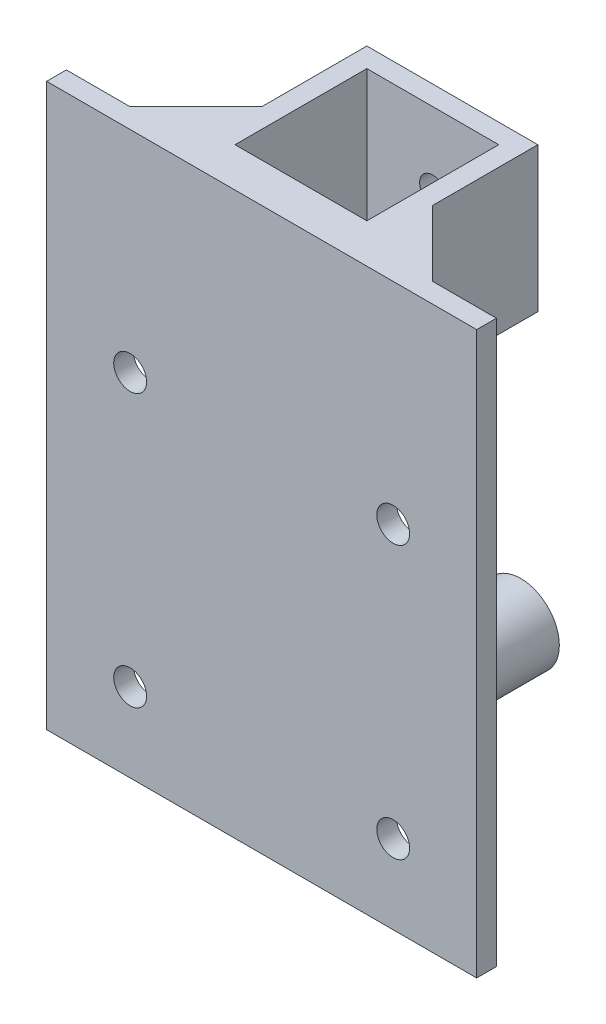
ISO-10303-21;
HEADER;
FILE_DESCRIPTION(('STEP AP214'),'2;1');
FILE_NAME('part.step','',(''),(''),'','','');
FILE_SCHEMA(('AUTOMOTIVE_DESIGN { 1 0 10303 214 1 1 1 1 }'));
ENDSEC;
DATA;
#1=APPLICATION_CONTEXT('core data for automotive mechanical design processes');
#2=APPLICATION_PROTOCOL_DEFINITION('international standard','automotive_design',2000,#1);
#3=PRODUCT_CONTEXT('',#1,'mechanical');
#4=PRODUCT('Part','Part','',(#3));
#5=PRODUCT_RELATED_PRODUCT_CATEGORY('part','',(#4));
#6=PRODUCT_DEFINITION_FORMATION('','',#4);
#7=PRODUCT_DEFINITION_CONTEXT('part definition',#1,'design');
#8=PRODUCT_DEFINITION('design','',#6,#7);
#9=PRODUCT_DEFINITION_SHAPE('','',#8);
#10=(LENGTH_UNIT() NAMED_UNIT(*) SI_UNIT(.MILLI.,.METRE.));
#11=(NAMED_UNIT(*) PLANE_ANGLE_UNIT() SI_UNIT($,.RADIAN.));
#12=(NAMED_UNIT(*) SI_UNIT($,.STERADIAN.) SOLID_ANGLE_UNIT());
#13=UNCERTAINTY_MEASURE_WITH_UNIT(LENGTH_MEASURE(1.E-05),#10,'distance_accuracy_value','');
#14=(GEOMETRIC_REPRESENTATION_CONTEXT(3) GLOBAL_UNCERTAINTY_ASSIGNED_CONTEXT((#13)) GLOBAL_UNIT_ASSIGNED_CONTEXT((#10,
#11,#12)) REPRESENTATION_CONTEXT('',''));
#15=CARTESIAN_POINT('',(0.,0.,0.));
#16=DIRECTION('',(0.,0.,1.));
#17=DIRECTION('',(1.,0.,0.));
#18=AXIS2_PLACEMENT_3D('',#15,#16,#17);
#19=CARTESIAN_POINT('',(0.,0.,0.));
#20=DIRECTION('',(0.,0.,1.));
#21=DIRECTION('',(1.,0.,0.));
#22=AXIS2_PLACEMENT_3D('',#19,#20,#21);
#23=PLANE('',#22);
#24=CARTESIAN_POINT('',(-54.7,32.7,0.));
#25=DIRECTION('',(0.,0.,1.));
#26=DIRECTION('',(1.,0.,0.));
#27=AXIS2_PLACEMENT_3D('',#24,#25,#26);
#28=CIRCLE('',#27,5.);
#29=CARTESIAN_POINT('',(-49.7,32.7,0.));
#30=VERTEX_POINT('',#29);
#31=EDGE_CURVE('E317',#30,#30,#28,.F.);
#32=ORIENTED_EDGE('',*,*,#31,.F.);
#33=EDGE_LOOP('',(#32));
#34=FACE_BOUND('',#33,.T.);
#35=CARTESIAN_POINT('',(-10.7,32.7,0.));
#36=DIRECTION('',(0.,0.,1.));
#37=DIRECTION('',(1.,0.,0.));
#38=AXIS2_PLACEMENT_3D('',#35,#36,#37);
#39=CIRCLE('',#38,5.87255145259778);
#40=CARTESIAN_POINT('',(-4.82744854740222,32.7,0.));
#41=VERTEX_POINT('',#40);
#42=EDGE_CURVE('E313',#41,#41,#39,.F.);
#43=ORIENTED_EDGE('',*,*,#42,.F.);
#44=EDGE_LOOP('',(#43));
#45=FACE_BOUND('',#44,.T.);
#46=CARTESIAN_POINT('',(-52.7,12.,0.));
#47=DIRECTION('',(0.,0.,1.));
#48=DIRECTION('',(-1.,0.,0.));
#49=AXIS2_PLACEMENT_3D('',#46,#47,#48);
#50=CIRCLE('',#49,2.5);
#51=CARTESIAN_POINT('',(-55.2,12.,0.));
#52=VERTEX_POINT('',#51);
#53=EDGE_CURVE('E238',#52,#52,#50,.T.);
#54=ORIENTED_EDGE('',*,*,#53,.T.);
#55=EDGE_LOOP('',(#54));
#56=FACE_BOUND('',#55,.T.);
#57=CARTESIAN_POINT('',(-12.7,12.,0.));
#58=DIRECTION('',(0.,0.,1.));
#59=DIRECTION('',(1.,0.,0.));
#60=AXIS2_PLACEMENT_3D('',#57,#58,#59);
#61=CIRCLE('',#60,2.5);
#62=CARTESIAN_POINT('',(-10.2,12.,0.));
#63=VERTEX_POINT('',#62);
#64=EDGE_CURVE('E243',#63,#63,#61,.T.);
#65=ORIENTED_EDGE('',*,*,#64,.T.);
#66=EDGE_LOOP('',(#65));
#67=FACE_BOUND('',#66,.T.);
#68=CARTESIAN_POINT('',(-12.7,53.4,0.));
#69=DIRECTION('',(0.,0.,1.));
#70=DIRECTION('',(-1.,0.,0.));
#71=AXIS2_PLACEMENT_3D('',#68,#69,#70);
#72=CIRCLE('',#71,2.5);
#73=CARTESIAN_POINT('',(-15.2,53.4,0.));
#74=VERTEX_POINT('',#73);
#75=EDGE_CURVE('E251',#74,#74,#72,.T.);
#76=ORIENTED_EDGE('',*,*,#75,.T.);
#77=EDGE_LOOP('',(#76));
#78=FACE_BOUND('',#77,.T.);
#79=CARTESIAN_POINT('',(-52.7,53.4,0.));
#80=DIRECTION('',(0.,0.,1.));
#81=DIRECTION('',(1.,0.,0.));
#82=AXIS2_PLACEMENT_3D('',#79,#80,#81);
#83=CIRCLE('',#82,2.5);
#84=CARTESIAN_POINT('',(-50.2,53.4,0.));
#85=VERTEX_POINT('',#84);
#86=EDGE_CURVE('E259',#85,#85,#83,.T.);
#87=ORIENTED_EDGE('',*,*,#86,.T.);
#88=EDGE_LOOP('',(#87));
#89=FACE_BOUND('',#88,.T.);
#90=DIRECTION('',(-1.,0.,0.));
#91=VECTOR('',#90,1.);
#92=CARTESIAN_POINT('',(-19.7,63.4,0.));
#93=LINE('',#92,#91);
#94=CARTESIAN_POINT('',(-9.70000000000007,63.4,0.));
#95=VERTEX_POINT('',#94);
#96=CARTESIAN_POINT('',(-55.6999999999999,63.4,0.));
#97=VERTEX_POINT('',#96);
#98=EDGE_CURVE('E65',#95,#97,#93,.T.);
#99=ORIENTED_EDGE('',*,*,#98,.F.);
#100=DIRECTION('',(0.,1.,0.));
#101=VECTOR('',#100,1.);
#102=CARTESIAN_POINT('',(-9.70000000000007,85.4,0.));
#103=LINE('',#102,#101);
#104=CARTESIAN_POINT('',(-9.70000000000007,85.4,0.));
#105=VERTEX_POINT('',#104);
#106=EDGE_CURVE('E70',#95,#105,#103,.T.);
#107=ORIENTED_EDGE('',*,*,#106,.T.);
#108=DIRECTION('',(-1.,0.,0.));
#109=VECTOR('',#108,1.);
#110=CARTESIAN_POINT('',(0.,85.4,0.));
#111=LINE('',#110,#109);
#112=CARTESIAN_POINT('',(0.,85.4,0.));
#113=VERTEX_POINT('',#112);
#114=EDGE_CURVE('E290',#113,#105,#111,.T.);
#115=ORIENTED_EDGE('',*,*,#114,.F.);
#116=DIRECTION('',(0.,1.,0.));
#117=VECTOR('',#116,1.);
#118=CARTESIAN_POINT('',(0.,0.,0.));
#119=LINE('',#118,#117);
#120=CARTESIAN_POINT('',(0.,0.,0.));
#121=VERTEX_POINT('',#120);
#122=EDGE_CURVE('E267',#121,#113,#119,.T.);
#123=ORIENTED_EDGE('',*,*,#122,.F.);
#124=DIRECTION('',(1.,0.,0.));
#125=VECTOR('',#124,1.);
#126=CARTESIAN_POINT('',(0.,0.,0.));
#127=LINE('',#126,#125);
#128=CARTESIAN_POINT('',(-65.4,0.,0.));
#129=VERTEX_POINT('',#128);
#130=EDGE_CURVE('E276',#129,#121,#127,.T.);
#131=ORIENTED_EDGE('',*,*,#130,.F.);
#132=DIRECTION('',(0.,-1.,0.));
#133=VECTOR('',#132,1.);
#134=CARTESIAN_POINT('',(-65.4,0.,0.));
#135=LINE('',#134,#133);
#136=CARTESIAN_POINT('',(-65.4,85.4,0.));
#137=VERTEX_POINT('',#136);
#138=EDGE_CURVE('E293',#137,#129,#135,.T.);
#139=ORIENTED_EDGE('',*,*,#138,.F.);
#140=CARTESIAN_POINT('',(-55.6999999999999,85.4,0.));
#141=VERTEX_POINT('',#140);
#142=EDGE_CURVE('E289',#141,#137,#111,.T.);
#143=ORIENTED_EDGE('',*,*,#142,.F.);
#144=DIRECTION('',(0.,-1.,0.));
#145=VECTOR('',#144,1.);
#146=CARTESIAN_POINT('',(-55.6999999999999,63.4,0.));
#147=LINE('',#146,#145);
#148=EDGE_CURVE('E325',#141,#97,#147,.T.);
#149=ORIENTED_EDGE('',*,*,#148,.T.);
#150=EDGE_LOOP('',(#99,#107,#115,#123,#131,#139,#143,#149));
#151=FACE_BOUND('',#150,.T.);
#152=ADVANCED_FACE('F47',(#34,#45,#56,#67,#78,#89,#151),#23,.F.);
#153=CARTESIAN_POINT('',(0.,0.,3.));
#154=DIRECTION('',(0.,0.,1.));
#155=DIRECTION('',(1.,0.,0.));
#156=AXIS2_PLACEMENT_3D('',#153,#154,#155);
#157=PLANE('',#156);
#158=CARTESIAN_POINT('',(-12.7,12.,3.));
#159=DIRECTION('',(0.,0.,1.));
#160=DIRECTION('',(1.,0.,0.));
#161=AXIS2_PLACEMENT_3D('',#158,#159,#160);
#162=CIRCLE('',#161,2.5);
#163=CARTESIAN_POINT('',(-10.2,12.,3.));
#164=VERTEX_POINT('',#163);
#165=EDGE_CURVE('E247',#164,#164,#162,.T.);
#166=ORIENTED_EDGE('',*,*,#165,.F.);
#167=EDGE_LOOP('',(#166));
#168=FACE_BOUND('',#167,.T.);
#169=CARTESIAN_POINT('',(-52.7,53.4,3.));
#170=DIRECTION('',(0.,0.,1.));
#171=DIRECTION('',(1.,0.,0.));
#172=AXIS2_PLACEMENT_3D('',#169,#170,#171);
#173=CIRCLE('',#172,2.5);
#174=CARTESIAN_POINT('',(-50.2,53.4,3.));
#175=VERTEX_POINT('',#174);
#176=EDGE_CURVE('E263',#175,#175,#173,.T.);
#177=ORIENTED_EDGE('',*,*,#176,.F.);
#178=EDGE_LOOP('',(#177));
#179=FACE_BOUND('',#178,.T.);
#180=DIRECTION('',(0.,1.,0.));
#181=VECTOR('',#180,1.);
#182=CARTESIAN_POINT('',(0.,0.,3.));
#183=LINE('',#182,#181);
#184=CARTESIAN_POINT('',(0.,0.,3.));
#185=VERTEX_POINT('',#184);
#186=CARTESIAN_POINT('',(0.,85.4,3.));
#187=VERTEX_POINT('',#186);
#188=EDGE_CURVE('E271',#185,#187,#183,.T.);
#189=ORIENTED_EDGE('',*,*,#188,.T.);
#190=DIRECTION('',(-1.,0.,0.));
#191=VECTOR('',#190,1.);
#192=CARTESIAN_POINT('',(0.,85.4,3.));
#193=LINE('',#192,#191);
#194=CARTESIAN_POINT('',(-65.4,85.4,3.));
#195=VERTEX_POINT('',#194);
#196=EDGE_CURVE('E275',#187,#195,#193,.T.);
#197=ORIENTED_EDGE('',*,*,#196,.T.);
#198=DIRECTION('',(0.,-1.,0.));
#199=VECTOR('',#198,1.);
#200=CARTESIAN_POINT('',(-65.4,0.,3.));
#201=LINE('',#200,#199);
#202=CARTESIAN_POINT('',(-65.4,0.,3.));
#203=VERTEX_POINT('',#202);
#204=EDGE_CURVE('E279',#195,#203,#201,.T.);
#205=ORIENTED_EDGE('',*,*,#204,.T.);
#206=DIRECTION('',(1.,0.,0.));
#207=VECTOR('',#206,1.);
#208=CARTESIAN_POINT('',(0.,0.,3.));
#209=LINE('',#208,#207);
#210=EDGE_CURVE('E282',#203,#185,#209,.T.);
#211=ORIENTED_EDGE('',*,*,#210,.T.);
#212=EDGE_LOOP('',(#189,#197,#205,#211));
#213=FACE_BOUND('',#212,.T.);
#214=CARTESIAN_POINT('',(-12.7,53.4,3.));
#215=DIRECTION('',(0.,0.,1.));
#216=DIRECTION('',(-1.,0.,0.));
#217=AXIS2_PLACEMENT_3D('',#214,#215,#216);
#218=CIRCLE('',#217,2.5);
#219=CARTESIAN_POINT('',(-15.2,53.4,3.));
#220=VERTEX_POINT('',#219);
#221=EDGE_CURVE('E255',#220,#220,#218,.T.);
#222=ORIENTED_EDGE('',*,*,#221,.F.);
#223=EDGE_LOOP('',(#222));
#224=FACE_BOUND('',#223,.T.);
#225=CARTESIAN_POINT('',(-52.7,12.,3.));
#226=DIRECTION('',(0.,0.,1.));
#227=DIRECTION('',(-1.,0.,0.));
#228=AXIS2_PLACEMENT_3D('',#225,#226,#227);
#229=CIRCLE('',#228,2.5);
#230=CARTESIAN_POINT('',(-55.2,12.,3.));
#231=VERTEX_POINT('',#230);
#232=EDGE_CURVE('E239',#231,#231,#229,.T.);
#233=ORIENTED_EDGE('',*,*,#232,.F.);
#234=EDGE_LOOP('',(#233));
#235=FACE_BOUND('',#234,.T.);
#236=ADVANCED_FACE('F375',(#168,#179,#213,#224,#235),#157,.T.);
#237=CARTESIAN_POINT('',(0.,0.,3.));
#238=DIRECTION('',(-1.,0.,0.));
#239=DIRECTION('',(0.,-1.,0.));
#240=AXIS2_PLACEMENT_3D('',#237,#238,#239);
#241=PLANE('',#240);
#242=ORIENTED_EDGE('',*,*,#122,.T.);
#243=DIRECTION('',(0.,0.,-1.));
#244=VECTOR('',#243,1.);
#245=CARTESIAN_POINT('',(0.,85.4,3.));
#246=LINE('',#245,#244);
#247=EDGE_CURVE('E309',#187,#113,#246,.T.);
#248=ORIENTED_EDGE('',*,*,#247,.F.);
#249=ORIENTED_EDGE('',*,*,#188,.F.);
#250=DIRECTION('',(0.,0.,-1.));
#251=VECTOR('',#250,1.);
#252=CARTESIAN_POINT('',(0.,0.,3.));
#253=LINE('',#252,#251);
#254=EDGE_CURVE('E285',#185,#121,#253,.T.);
#255=ORIENTED_EDGE('',*,*,#254,.T.);
#256=EDGE_LOOP('',(#242,#248,#249,#255));
#257=FACE_BOUND('',#256,.T.);
#258=ADVANCED_FACE('F382',(#257),#241,.F.);
#259=CARTESIAN_POINT('',(0.,85.4,3.));
#260=DIRECTION('',(0.,-1.,0.));
#261=DIRECTION('',(0.,0.,-1.));
#262=AXIS2_PLACEMENT_3D('',#259,#260,#261);
#263=PLANE('',#262);
#264=DIRECTION('',(-1.,0.,0.));
#265=VECTOR('',#264,1.);
#266=CARTESIAN_POINT('',(-42.725,85.4,-2.975));
#267=LINE('',#266,#265);
#268=CARTESIAN_POINT('',(-22.675,85.4,-2.975));
#269=VERTEX_POINT('',#268);
#270=CARTESIAN_POINT('',(-42.725,85.4,-2.975));
#271=VERTEX_POINT('',#270);
#272=EDGE_CURVE('E162',#269,#271,#267,.T.);
#273=ORIENTED_EDGE('',*,*,#272,.T.);
#274=DIRECTION('',(0.,0.,-1.));
#275=VECTOR('',#274,1.);
#276=CARTESIAN_POINT('',(-42.725,85.4,-2.975));
#277=LINE('',#276,#275);
#278=CARTESIAN_POINT('',(-42.725,85.4,-23.025));
#279=VERTEX_POINT('',#278);
#280=EDGE_CURVE('E153',#271,#279,#277,.T.);
#281=ORIENTED_EDGE('',*,*,#280,.T.);
#282=DIRECTION('',(1.,0.,0.));
#283=VECTOR('',#282,1.);
#284=CARTESIAN_POINT('',(-42.725,85.4,-23.025));
#285=LINE('',#284,#283);
#286=CARTESIAN_POINT('',(-22.675,85.4,-23.025));
#287=VERTEX_POINT('',#286);
#288=EDGE_CURVE('E166',#279,#287,#285,.T.);
#289=ORIENTED_EDGE('',*,*,#288,.T.);
#290=DIRECTION('',(0.,0.,1.));
#291=VECTOR('',#290,1.);
#292=CARTESIAN_POINT('',(-22.675,85.4,-2.975));
#293=LINE('',#292,#291);
#294=EDGE_CURVE('E171',#287,#269,#293,.T.);
#295=ORIENTED_EDGE('',*,*,#294,.T.);
#296=EDGE_LOOP('',(#273,#281,#289,#295));
#297=FACE_BOUND('',#296,.T.);
#298=ORIENTED_EDGE('',*,*,#114,.T.);
#299=DIRECTION('',(0.707106781186543,0.,0.707106781186552));
#300=VECTOR('',#299,1.);
#301=CARTESIAN_POINT('',(-3.35000000000009,85.4,6.35000000000005));
#302=LINE('',#301,#300);
#303=CARTESIAN_POINT('',(-19.7,85.4,-10.0000000000001));
#304=VERTEX_POINT('',#303);
#305=EDGE_CURVE('E11',#105,#304,#302,.F.);
#306=ORIENTED_EDGE('',*,*,#305,.T.);
#307=DIRECTION('',(0.,0.,1.));
#308=VECTOR('',#307,1.);
#309=CARTESIAN_POINT('',(-19.7,85.4,-26.));
#310=LINE('',#309,#308);
#311=CARTESIAN_POINT('',(-19.7,85.4,-26.));
#312=VERTEX_POINT('',#311);
#313=EDGE_CURVE('E220',#312,#304,#310,.T.);
#314=ORIENTED_EDGE('',*,*,#313,.F.);
#315=DIRECTION('',(1.,0.,0.));
#316=VECTOR('',#315,1.);
#317=CARTESIAN_POINT('',(-19.7,85.4,-26.));
#318=LINE('',#317,#316);
#319=CARTESIAN_POINT('',(-45.7,85.4,-26.));
#320=VERTEX_POINT('',#319);
#321=EDGE_CURVE('E217',#320,#312,#318,.T.);
#322=ORIENTED_EDGE('',*,*,#321,.F.);
#323=DIRECTION('',(0.,0.,1.));
#324=VECTOR('',#323,1.);
#325=CARTESIAN_POINT('',(-45.7,85.4,-26.));
#326=LINE('',#325,#324);
#327=CARTESIAN_POINT('',(-45.7,85.4,-10.0000000000001));
#328=VERTEX_POINT('',#327);
#329=EDGE_CURVE('E226',#320,#328,#326,.T.);
#330=ORIENTED_EDGE('',*,*,#329,.T.);
#331=DIRECTION('',(0.707106781186544,0.,-0.707106781186551));
#332=VECTOR('',#331,1.);
#333=CARTESIAN_POINT('',(-29.3500000000003,85.4,-26.3499999999999));
#334=LINE('',#333,#332);
#335=EDGE_CURVE('E328',#328,#141,#334,.F.);
#336=ORIENTED_EDGE('',*,*,#335,.T.);
#337=ORIENTED_EDGE('',*,*,#142,.T.);
#338=DIRECTION('',(0.,0.,-1.));
#339=VECTOR('',#338,1.);
#340=CARTESIAN_POINT('',(-65.4,85.4,3.));
#341=LINE('',#340,#339);
#342=EDGE_CURVE('E305',#195,#137,#341,.T.);
#343=ORIENTED_EDGE('',*,*,#342,.F.);
#344=ORIENTED_EDGE('',*,*,#196,.F.);
#345=ORIENTED_EDGE('',*,*,#247,.T.);
#346=EDGE_LOOP('',(#298,#306,#314,#322,#330,#336,#337,#343,#344,#345));
#347=FACE_BOUND('',#346,.T.);
#348=ADVANCED_FACE('F173',(#297,#347),#263,.F.);
#349=CARTESIAN_POINT('',(-65.4,0.,3.));
#350=DIRECTION('',(1.,0.,0.));
#351=DIRECTION('',(0.,0.,-1.));
#352=AXIS2_PLACEMENT_3D('',#349,#350,#351);
#353=PLANE('',#352);
#354=ORIENTED_EDGE('',*,*,#138,.T.);
#355=DIRECTION('',(0.,0.,-1.));
#356=VECTOR('',#355,1.);
#357=CARTESIAN_POINT('',(-65.4,0.,3.));
#358=LINE('',#357,#356);
#359=EDGE_CURVE('E301',#203,#129,#358,.T.);
#360=ORIENTED_EDGE('',*,*,#359,.F.);
#361=ORIENTED_EDGE('',*,*,#204,.F.);
#362=ORIENTED_EDGE('',*,*,#342,.T.);
#363=EDGE_LOOP('',(#354,#360,#361,#362));
#364=FACE_BOUND('',#363,.T.);
#365=ADVANCED_FACE('F371',(#364),#353,.F.);
#366=CARTESIAN_POINT('',(0.,0.,3.));
#367=DIRECTION('',(0.,1.,0.));
#368=DIRECTION('',(-1.,0.,0.));
#369=AXIS2_PLACEMENT_3D('',#366,#367,#368);
#370=PLANE('',#369);
#371=ORIENTED_EDGE('',*,*,#130,.T.);
#372=ORIENTED_EDGE('',*,*,#254,.F.);
#373=ORIENTED_EDGE('',*,*,#210,.F.);
#374=ORIENTED_EDGE('',*,*,#359,.T.);
#375=EDGE_LOOP('',(#371,#372,#373,#374));
#376=FACE_BOUND('',#375,.T.);
#377=ADVANCED_FACE('F384',(#376),#370,.F.);
#378=CARTESIAN_POINT('',(-52.7,53.4,3.));
#379=DIRECTION('',(0.,0.,-1.));
#380=DIRECTION('',(-1.,0.,0.));
#381=AXIS2_PLACEMENT_3D('',#378,#379,#380);
#382=CYLINDRICAL_SURFACE('',#381,2.5);
#383=ORIENTED_EDGE('',*,*,#176,.T.);
#384=EDGE_LOOP('',(#383));
#385=FACE_BOUND('',#384,.T.);
#386=ORIENTED_EDGE('',*,*,#86,.F.);
#387=EDGE_LOOP('',(#386));
#388=FACE_BOUND('',#387,.T.);
#389=ADVANCED_FACE('F386',(#385,#388),#382,.F.);
#390=CARTESIAN_POINT('',(-12.7,53.4,3.));
#391=DIRECTION('',(0.,0.,-1.));
#392=DIRECTION('',(-1.,0.,0.));
#393=AXIS2_PLACEMENT_3D('',#390,#391,#392);
#394=CYLINDRICAL_SURFACE('',#393,2.5);
#395=ORIENTED_EDGE('',*,*,#221,.T.);
#396=EDGE_LOOP('',(#395));
#397=FACE_BOUND('',#396,.T.);
#398=ORIENTED_EDGE('',*,*,#75,.F.);
#399=EDGE_LOOP('',(#398));
#400=FACE_BOUND('',#399,.T.);
#401=ADVANCED_FACE('F392',(#397,#400),#394,.F.);
#402=CARTESIAN_POINT('',(-12.7,12.,3.));
#403=DIRECTION('',(0.,0.,-1.));
#404=DIRECTION('',(-1.,0.,0.));
#405=AXIS2_PLACEMENT_3D('',#402,#403,#404);
#406=CYLINDRICAL_SURFACE('',#405,2.5);
#407=ORIENTED_EDGE('',*,*,#165,.T.);
#408=EDGE_LOOP('',(#407));
#409=FACE_BOUND('',#408,.T.);
#410=ORIENTED_EDGE('',*,*,#64,.F.);
#411=EDGE_LOOP('',(#410));
#412=FACE_BOUND('',#411,.T.);
#413=ADVANCED_FACE('F411',(#409,#412),#406,.F.);
#414=CARTESIAN_POINT('',(-52.7,12.,3.));
#415=DIRECTION('',(0.,0.,-1.));
#416=DIRECTION('',(-1.,0.,0.));
#417=AXIS2_PLACEMENT_3D('',#414,#415,#416);
#418=CYLINDRICAL_SURFACE('',#417,2.5);
#419=ORIENTED_EDGE('',*,*,#232,.T.);
#420=EDGE_LOOP('',(#419));
#421=FACE_BOUND('',#420,.T.);
#422=ORIENTED_EDGE('',*,*,#53,.F.);
#423=EDGE_LOOP('',(#422));
#424=FACE_BOUND('',#423,.T.);
#425=ADVANCED_FACE('F415',(#421,#424),#418,.F.);
#426=CARTESIAN_POINT('',(-19.7,85.4,-26.));
#427=DIRECTION('',(-1.,0.,0.));
#428=DIRECTION('',(0.,-1.,0.));
#429=AXIS2_PLACEMENT_3D('',#426,#427,#428);
#430=PLANE('',#429);
#431=ORIENTED_EDGE('',*,*,#313,.T.);
#432=DIRECTION('',(0.,-1.,0.));
#433=VECTOR('',#432,1.);
#434=CARTESIAN_POINT('',(-19.7,63.4,-10.));
#435=LINE('',#434,#433);
#436=CARTESIAN_POINT('',(-19.7,63.4,-10.0000000000001));
#437=VERTEX_POINT('',#436);
#438=EDGE_CURVE('E334',#304,#437,#435,.T.);
#439=ORIENTED_EDGE('',*,*,#438,.T.);
#440=DIRECTION('',(0.,0.,1.));
#441=VECTOR('',#440,1.);
#442=CARTESIAN_POINT('',(-19.7,63.4,-26.));
#443=LINE('',#442,#441);
#444=CARTESIAN_POINT('',(-19.7,63.4,-26.));
#445=VERTEX_POINT('',#444);
#446=EDGE_CURVE('E234',#445,#437,#443,.T.);
#447=ORIENTED_EDGE('',*,*,#446,.F.);
#448=DIRECTION('',(0.,-1.,0.));
#449=VECTOR('',#448,1.);
#450=CARTESIAN_POINT('',(-19.7,85.4,-26.));
#451=LINE('',#450,#449);
#452=EDGE_CURVE('E207',#312,#445,#451,.T.);
#453=ORIENTED_EDGE('',*,*,#452,.F.);
#454=EDGE_LOOP('',(#431,#439,#447,#453));
#455=FACE_BOUND('',#454,.T.);
#456=ADVANCED_FACE('F351',(#455),#430,.F.);
#457=CARTESIAN_POINT('',(-19.7,63.4,-26.));
#458=DIRECTION('',(0.,1.,0.));
#459=DIRECTION('',(0.,0.,1.));
#460=AXIS2_PLACEMENT_3D('',#457,#458,#459);
#461=PLANE('',#460);
#462=DIRECTION('',(1.,0.,0.));
#463=VECTOR('',#462,1.);
#464=CARTESIAN_POINT('',(-42.725,63.4,-23.025));
#465=LINE('',#464,#463);
#466=CARTESIAN_POINT('',(-42.725,63.4,-23.025));
#467=VERTEX_POINT('',#466);
#468=CARTESIAN_POINT('',(-22.675,63.4,-23.025));
#469=VERTEX_POINT('',#468);
#470=EDGE_CURVE('E193',#467,#469,#465,.T.);
#471=ORIENTED_EDGE('',*,*,#470,.F.);
#472=DIRECTION('',(0.,0.,-1.));
#473=VECTOR('',#472,1.);
#474=CARTESIAN_POINT('',(-42.725,63.4,-2.975));
#475=LINE('',#474,#473);
#476=CARTESIAN_POINT('',(-42.725,63.4,-2.975));
#477=VERTEX_POINT('',#476);
#478=EDGE_CURVE('E156',#477,#467,#475,.T.);
#479=ORIENTED_EDGE('',*,*,#478,.F.);
#480=DIRECTION('',(-1.,0.,0.));
#481=VECTOR('',#480,1.);
#482=CARTESIAN_POINT('',(-42.725,63.4,-2.975));
#483=LINE('',#482,#481);
#484=CARTESIAN_POINT('',(-22.675,63.4,-2.975));
#485=VERTEX_POINT('',#484);
#486=EDGE_CURVE('E177',#485,#477,#483,.T.);
#487=ORIENTED_EDGE('',*,*,#486,.F.);
#488=DIRECTION('',(0.,0.,1.));
#489=VECTOR('',#488,1.);
#490=CARTESIAN_POINT('',(-22.675,63.4,-2.975));
#491=LINE('',#490,#489);
#492=EDGE_CURVE('E181',#469,#485,#491,.T.);
#493=ORIENTED_EDGE('',*,*,#492,.F.);
#494=EDGE_LOOP('',(#471,#479,#487,#493));
#495=FACE_BOUND('',#494,.T.);
#496=ORIENTED_EDGE('',*,*,#98,.T.);
#497=DIRECTION('',(-0.707106781186544,0.,0.707106781186551));
#498=VECTOR('',#497,1.);
#499=CARTESIAN_POINT('',(-24.7000000000002,63.4,-31.0000000000001));
#500=LINE('',#499,#498);
#501=CARTESIAN_POINT('',(-45.7,63.4,-10.0000000000001));
#502=VERTEX_POINT('',#501);
#503=EDGE_CURVE('E331',#97,#502,#500,.F.);
#504=ORIENTED_EDGE('',*,*,#503,.T.);
#505=DIRECTION('',(0.,0.,1.));
#506=VECTOR('',#505,1.);
#507=CARTESIAN_POINT('',(-45.7,63.4,-26.));
#508=LINE('',#507,#506);
#509=CARTESIAN_POINT('',(-45.7,63.4,-26.));
#510=VERTEX_POINT('',#509);
#511=EDGE_CURVE('E230',#510,#502,#508,.T.);
#512=ORIENTED_EDGE('',*,*,#511,.F.);
#513=DIRECTION('',(-1.,0.,0.));
#514=VECTOR('',#513,1.);
#515=CARTESIAN_POINT('',(-19.7,63.4,-26.));
#516=LINE('',#515,#514);
#517=EDGE_CURVE('E211',#445,#510,#516,.T.);
#518=ORIENTED_EDGE('',*,*,#517,.F.);
#519=ORIENTED_EDGE('',*,*,#446,.T.);
#520=DIRECTION('',(-0.707106781186543,0.,-0.707106781186552));
#521=VECTOR('',#520,1.);
#522=CARTESIAN_POINT('',(-27.7,63.4,-18.0000000000001));
#523=LINE('',#522,#521);
#524=EDGE_CURVE('E58',#437,#95,#523,.F.);
#525=ORIENTED_EDGE('',*,*,#524,.T.);
#526=EDGE_LOOP('',(#496,#504,#512,#518,#519,#525));
#527=FACE_BOUND('',#526,.T.);
#528=ADVANCED_FACE('F342',(#495,#527),#461,.F.);
#529=CARTESIAN_POINT('',(-45.7,85.4,-26.));
#530=DIRECTION('',(1.,0.,0.));
#531=DIRECTION('',(0.,1.,0.));
#532=AXIS2_PLACEMENT_3D('',#529,#530,#531);
#533=PLANE('',#532);
#534=ORIENTED_EDGE('',*,*,#511,.T.);
#535=DIRECTION('',(0.,1.,0.));
#536=VECTOR('',#535,1.);
#537=CARTESIAN_POINT('',(-45.7,85.4,-10.));
#538=LINE('',#537,#536);
#539=EDGE_CURVE('E321',#502,#328,#538,.T.);
#540=ORIENTED_EDGE('',*,*,#539,.T.);
#541=ORIENTED_EDGE('',*,*,#329,.F.);
#542=DIRECTION('',(0.,1.,0.));
#543=VECTOR('',#542,1.);
#544=CARTESIAN_POINT('',(-45.7,85.4,-26.));
#545=LINE('',#544,#543);
#546=EDGE_CURVE('E214',#510,#320,#545,.T.);
#547=ORIENTED_EDGE('',*,*,#546,.F.);
#548=EDGE_LOOP('',(#534,#540,#541,#547));
#549=FACE_BOUND('',#548,.T.);
#550=ADVANCED_FACE('F359',(#549),#533,.F.);
#551=CARTESIAN_POINT('',(0.,0.,-26.));
#552=DIRECTION('',(0.,0.,-1.));
#553=DIRECTION('',(-1.,0.,0.));
#554=AXIS2_PLACEMENT_3D('',#551,#552,#553);
#555=PLANE('',#554);
#556=CARTESIAN_POINT('',(-32.7,74.4,-26.));
#557=DIRECTION('',(0.,0.,-1.));
#558=DIRECTION('',(-1.,0.,0.));
#559=AXIS2_PLACEMENT_3D('',#556,#557,#558);
#560=CIRCLE('',#559,2.);
#561=CARTESIAN_POINT('',(-34.7,74.4,-26.));
#562=VERTEX_POINT('',#561);
#563=EDGE_CURVE('E484',#562,#562,#560,.T.);
#564=ORIENTED_EDGE('',*,*,#563,.F.);
#565=EDGE_LOOP('',(#564));
#566=FACE_BOUND('',#565,.T.);
#567=ORIENTED_EDGE('',*,*,#452,.T.);
#568=ORIENTED_EDGE('',*,*,#517,.T.);
#569=ORIENTED_EDGE('',*,*,#546,.T.);
#570=ORIENTED_EDGE('',*,*,#321,.T.);
#571=EDGE_LOOP('',(#567,#568,#569,#570));
#572=FACE_BOUND('',#571,.T.);
#573=ADVANCED_FACE('F353',(#566,#572),#555,.T.);
#574=CARTESIAN_POINT('',(-42.725,85.4,-2.975));
#575=DIRECTION('',(-1.,0.,0.));
#576=DIRECTION('',(0.,0.,1.));
#577=AXIS2_PLACEMENT_3D('',#574,#575,#576);
#578=PLANE('',#577);
#579=ORIENTED_EDGE('',*,*,#478,.T.);
#580=DIRECTION('',(0.,-1.,0.));
#581=VECTOR('',#580,1.);
#582=CARTESIAN_POINT('',(-42.725,85.4,-23.025));
#583=LINE('',#582,#581);
#584=EDGE_CURVE('E149',#279,#467,#583,.T.);
#585=ORIENTED_EDGE('',*,*,#584,.F.);
#586=ORIENTED_EDGE('',*,*,#280,.F.);
#587=DIRECTION('',(0.,-1.,0.));
#588=VECTOR('',#587,1.);
#589=CARTESIAN_POINT('',(-42.725,85.4,-2.975));
#590=LINE('',#589,#588);
#591=EDGE_CURVE('E199',#271,#477,#590,.T.);
#592=ORIENTED_EDGE('',*,*,#591,.T.);
#593=EDGE_LOOP('',(#579,#585,#586,#592));
#594=FACE_BOUND('',#593,.T.);
#595=ADVANCED_FACE('F151',(#594),#578,.F.);
#596=CARTESIAN_POINT('',(-42.725,85.4,-2.975));
#597=DIRECTION('',(0.,0.,1.));
#598=DIRECTION('',(1.,0.,0.));
#599=AXIS2_PLACEMENT_3D('',#596,#597,#598);
#600=PLANE('',#599);
#601=ORIENTED_EDGE('',*,*,#486,.T.);
#602=ORIENTED_EDGE('',*,*,#591,.F.);
#603=ORIENTED_EDGE('',*,*,#272,.F.);
#604=DIRECTION('',(0.,-1.,0.));
#605=VECTOR('',#604,1.);
#606=CARTESIAN_POINT('',(-22.675,85.4,-2.975));
#607=LINE('',#606,#605);
#608=EDGE_CURVE('E202',#269,#485,#607,.T.);
#609=ORIENTED_EDGE('',*,*,#608,.T.);
#610=EDGE_LOOP('',(#601,#602,#603,#609));
#611=FACE_BOUND('',#610,.T.);
#612=ADVANCED_FACE('F432',(#611),#600,.F.);
#613=CARTESIAN_POINT('',(-22.675,85.4,-2.975));
#614=DIRECTION('',(1.,0.,0.));
#615=DIRECTION('',(0.,1.,0.));
#616=AXIS2_PLACEMENT_3D('',#613,#614,#615);
#617=PLANE('',#616);
#618=ORIENTED_EDGE('',*,*,#492,.T.);
#619=ORIENTED_EDGE('',*,*,#608,.F.);
#620=ORIENTED_EDGE('',*,*,#294,.F.);
#621=DIRECTION('',(0.,-1.,0.));
#622=VECTOR('',#621,1.);
#623=CARTESIAN_POINT('',(-22.675,85.4,-23.025));
#624=LINE('',#623,#622);
#625=EDGE_CURVE('E161',#287,#469,#624,.T.);
#626=ORIENTED_EDGE('',*,*,#625,.T.);
#627=EDGE_LOOP('',(#618,#619,#620,#626));
#628=FACE_BOUND('',#627,.T.);
#629=ADVANCED_FACE('F436',(#628),#617,.F.);
#630=CARTESIAN_POINT('',(-42.725,85.4,-23.025));
#631=DIRECTION('',(0.,0.,-1.));
#632=DIRECTION('',(-1.,0.,0.));
#633=AXIS2_PLACEMENT_3D('',#630,#631,#632);
#634=PLANE('',#633);
#635=CARTESIAN_POINT('',(-32.7,74.4,-23.025));
#636=DIRECTION('',(0.,0.,-1.));
#637=DIRECTION('',(-1.,0.,0.));
#638=AXIS2_PLACEMENT_3D('',#635,#636,#637);
#639=CIRCLE('',#638,2.);
#640=CARTESIAN_POINT('',(-34.7,74.4,-23.025));
#641=VERTEX_POINT('',#640);
#642=EDGE_CURVE('E52',#641,#641,#639,.T.);
#643=ORIENTED_EDGE('',*,*,#642,.T.);
#644=EDGE_LOOP('',(#643));
#645=FACE_BOUND('',#644,.T.);
#646=ORIENTED_EDGE('',*,*,#470,.T.);
#647=ORIENTED_EDGE('',*,*,#625,.F.);
#648=ORIENTED_EDGE('',*,*,#288,.F.);
#649=ORIENTED_EDGE('',*,*,#584,.T.);
#650=EDGE_LOOP('',(#646,#647,#648,#649));
#651=FACE_BOUND('',#650,.T.);
#652=ADVANCED_FACE('F167',(#645,#651),#634,.F.);
#653=CARTESIAN_POINT('',(-10.7,32.7,-14.4));
#654=DIRECTION('',(0.,0.,1.));
#655=DIRECTION('',(1.,0.,0.));
#656=AXIS2_PLACEMENT_3D('',#653,#654,#655);
#657=CYLINDRICAL_SURFACE('',#656,5.87255145259778);
#658=CARTESIAN_POINT('',(-10.7,32.7,-14.4));
#659=DIRECTION('',(0.,0.,-1.));
#660=DIRECTION('',(-1.,0.,0.));
#661=AXIS2_PLACEMENT_3D('',#658,#659,#660);
#662=CIRCLE('',#661,5.87255145259778);
#663=CARTESIAN_POINT('',(-16.5725514525978,32.7,-14.4));
#664=VERTEX_POINT('',#663);
#665=EDGE_CURVE('E184',#664,#664,#662,.T.);
#666=ORIENTED_EDGE('',*,*,#665,.F.);
#667=EDGE_LOOP('',(#666));
#668=FACE_BOUND('',#667,.T.);
#669=ORIENTED_EDGE('',*,*,#42,.T.);
#670=EDGE_LOOP('',(#669));
#671=FACE_BOUND('',#670,.T.);
#672=ADVANCED_FACE('F435',(#668,#671),#657,.T.);
#673=CARTESIAN_POINT('',(-10.7,32.7,-14.4));
#674=DIRECTION('',(0.,0.,-1.));
#675=DIRECTION('',(-1.,0.,0.));
#676=AXIS2_PLACEMENT_3D('',#673,#674,#675);
#677=PLANE('',#676);
#678=CARTESIAN_POINT('',(-10.7,32.7,-14.4));
#679=DIRECTION('',(0.,0.,-1.));
#680=DIRECTION('',(-1.,0.,0.));
#681=AXIS2_PLACEMENT_3D('',#678,#679,#680);
#682=CIRCLE('',#681,2.);
#683=CARTESIAN_POINT('',(-12.7,32.7,-14.4));
#684=VERTEX_POINT('',#683);
#685=EDGE_CURVE('E488',#684,#684,#682,.T.);
#686=ORIENTED_EDGE('',*,*,#685,.F.);
#687=EDGE_LOOP('',(#686));
#688=FACE_BOUND('',#687,.T.);
#689=ORIENTED_EDGE('',*,*,#665,.T.);
#690=EDGE_LOOP('',(#689));
#691=FACE_BOUND('',#690,.T.);
#692=ADVANCED_FACE('F446',(#688,#691),#677,.T.);
#693=CARTESIAN_POINT('',(-54.7,32.7,-21.));
#694=DIRECTION('',(0.,0.,1.));
#695=DIRECTION('',(1.,0.,0.));
#696=AXIS2_PLACEMENT_3D('',#693,#694,#695);
#697=CYLINDRICAL_SURFACE('',#696,5.);
#698=CARTESIAN_POINT('',(-54.7,32.7,-21.));
#699=DIRECTION('',(0.,0.,-1.));
#700=DIRECTION('',(-1.,0.,0.));
#701=AXIS2_PLACEMENT_3D('',#698,#699,#700);
#702=CIRCLE('',#701,5.);
#703=CARTESIAN_POINT('',(-49.7,32.7,-21.));
#704=VERTEX_POINT('',#703);
#705=EDGE_CURVE('E504',#704,#704,#702,.T.);
#706=CARTESIAN_POINT('',(-49.7,32.7,-21.));
#707=CARTESIAN_POINT('',(-49.7,32.7,-20.78125));
#708=CARTESIAN_POINT('',(-49.7,32.7,-20.5625));
#709=CARTESIAN_POINT('',(-49.7,32.7,-20.125));
#710=CARTESIAN_POINT('',(-49.7,32.7,-19.90625));
#711=CARTESIAN_POINT('',(-49.7,32.7,-19.46875));
#712=CARTESIAN_POINT('',(-49.7,32.7,-19.25));
#713=CARTESIAN_POINT('',(-49.7,32.7,-18.8125));
#714=CARTESIAN_POINT('',(-49.7,32.7,-18.59375));
#715=CARTESIAN_POINT('',(-49.7,32.7,-18.15625));
#716=CARTESIAN_POINT('',(-49.7,32.7,-17.9375));
#717=CARTESIAN_POINT('',(-49.7,32.7,-17.5));
#718=CARTESIAN_POINT('',(-49.7,32.7,-17.28125));
#719=CARTESIAN_POINT('',(-49.7,32.7,-16.84375));
#720=CARTESIAN_POINT('',(-49.7,32.7,-16.625));
#721=CARTESIAN_POINT('',(-49.7,32.7,-16.1875));
#722=CARTESIAN_POINT('',(-49.7,32.7,-15.96875));
#723=CARTESIAN_POINT('',(-49.7,32.7,-15.53125));
#724=CARTESIAN_POINT('',(-49.7,32.7,-15.3125));
#725=CARTESIAN_POINT('',(-49.7,32.7,-14.875));
#726=CARTESIAN_POINT('',(-49.7,32.7,-14.65625));
#727=CARTESIAN_POINT('',(-49.7,32.7,-14.21875));
#728=CARTESIAN_POINT('',(-49.7,32.7,-14.));
#729=CARTESIAN_POINT('',(-49.7,32.7,-13.5625));
#730=CARTESIAN_POINT('',(-49.7,32.7,-13.34375));
#731=CARTESIAN_POINT('',(-49.7,32.7,-12.90625));
#732=CARTESIAN_POINT('',(-49.7,32.7,-12.6875));
#733=CARTESIAN_POINT('',(-49.7,32.7,-12.25));
#734=CARTESIAN_POINT('',(-49.7,32.7,-12.03125));
#735=CARTESIAN_POINT('',(-49.7,32.7,-11.59375));
#736=CARTESIAN_POINT('',(-49.7,32.7,-11.375));
#737=CARTESIAN_POINT('',(-49.7,32.7,-10.9375));
#738=CARTESIAN_POINT('',(-49.7,32.7,-10.71875));
#739=CARTESIAN_POINT('',(-49.7,32.7,-10.28125));
#740=CARTESIAN_POINT('',(-49.7,32.7,-10.0625));
#741=CARTESIAN_POINT('',(-49.7,32.7,-9.625));
#742=CARTESIAN_POINT('',(-49.7,32.7,-9.40625));
#743=CARTESIAN_POINT('',(-49.7,32.7,-8.96875));
#744=CARTESIAN_POINT('',(-49.7,32.7,-8.75));
#745=CARTESIAN_POINT('',(-49.7,32.7,-8.3125));
#746=CARTESIAN_POINT('',(-49.7,32.7,-8.09375));
#747=CARTESIAN_POINT('',(-49.7,32.7,-7.65625));
#748=CARTESIAN_POINT('',(-49.7,32.7,-7.4375));
#749=CARTESIAN_POINT('',(-49.7,32.7,-7.));
#750=CARTESIAN_POINT('',(-49.7,32.7,-6.78125));
#751=CARTESIAN_POINT('',(-49.7,32.7,-6.34375));
#752=CARTESIAN_POINT('',(-49.7,32.7,-6.125));
#753=CARTESIAN_POINT('',(-49.7,32.7,-5.6875));
#754=CARTESIAN_POINT('',(-49.7,32.7,-5.46875));
#755=CARTESIAN_POINT('',(-49.7,32.7,-5.03125));
#756=CARTESIAN_POINT('',(-49.7,32.7,-4.8125));
#757=CARTESIAN_POINT('',(-49.7,32.7,-4.375));
#758=CARTESIAN_POINT('',(-49.7,32.7,-4.15625));
#759=CARTESIAN_POINT('',(-49.7,32.7,-3.71875));
#760=CARTESIAN_POINT('',(-49.7,32.7,-3.5));
#761=CARTESIAN_POINT('',(-49.7,32.7,-3.0625));
#762=CARTESIAN_POINT('',(-49.7,32.7,-2.84375));
#763=CARTESIAN_POINT('',(-49.7,32.7,-2.40625));
#764=CARTESIAN_POINT('',(-49.7,32.7,-2.1875));
#765=CARTESIAN_POINT('',(-49.7,32.7,-1.75));
#766=CARTESIAN_POINT('',(-49.7,32.7,-1.53125));
#767=CARTESIAN_POINT('',(-49.7,32.7,-1.09375));
#768=CARTESIAN_POINT('',(-49.7,32.7,-0.875000000000001));
#769=CARTESIAN_POINT('',(-49.7,32.7,-0.4375));
#770=CARTESIAN_POINT('',(-49.7,32.7,-0.21875));
#771=CARTESIAN_POINT('',(-49.7,32.7,0.));
#772=B_SPLINE_CURVE_WITH_KNOTS('',3,(#706,#707,#708,#709,#710,#711,#712,#713,#714,#715,#716,
#717,#718,#719,#720,#721,#722,#723,#724,#725,#726,#727,#728,#729,#730,#731,#732,#733,#734,#735,
#736,#737,#738,#739,#740,#741,#742,#743,#744,#745,#746,#747,#748,#749,#750,#751,#752,#753,#754,
#755,#756,#757,#758,#759,#760,#761,#762,#763,#764,#765,#766,#767,#768,#769,#770,#771),
.UNSPECIFIED.,.F.,.F.,(4,2,2,2,2,2,2,2,2,2,2,2,2,2,2,2,2,2,2,2,2,2,2,2,2,2,2,2,2,2,2,2,4),(0.,
0.656250000000001,1.3125,1.96875,2.625,3.28125,3.9375,4.59375,5.25,5.90625,6.5625,7.21875,7.875,
8.53125,9.1875,9.84375,10.5,11.15625,11.8125,12.46875,13.125,13.78125,14.4375,15.09375,15.75,
16.40625,17.0625,17.71875,18.375,19.03125,19.6875,20.34375,21.),.UNSPECIFIED.);
#773=EDGE_CURVE('BSEAM450',#704,#30,#772,.T.);
#774=ORIENTED_EDGE('',*,*,#705,.F.);
#775=ORIENTED_EDGE('',*,*,#31,.T.);
#776=ORIENTED_EDGE('',*,*,#773,.T.);
#777=ORIENTED_EDGE('',*,*,#773,.F.);
#778=EDGE_LOOP('',(#774,#776,#775,#777));
#779=FACE_BOUND('',#778,.T.);
#780=ADVANCED_FACE('F450',(#779),#697,.T.);
#781=CARTESIAN_POINT('',(-54.7,32.7,-21.));
#782=DIRECTION('',(0.,0.,-1.));
#783=DIRECTION('',(-1.,0.,0.));
#784=AXIS2_PLACEMENT_3D('',#781,#782,#783);
#785=PLANE('',#784);
#786=CARTESIAN_POINT('',(-54.7,32.7,-21.));
#787=DIRECTION('',(0.,0.,-1.));
#788=DIRECTION('',(-1.,0.,0.));
#789=AXIS2_PLACEMENT_3D('',#786,#787,#788);
#790=CIRCLE('',#789,2.);
#791=CARTESIAN_POINT('',(-56.7,32.7,-21.));
#792=VERTEX_POINT('',#791);
#793=EDGE_CURVE('E498',#792,#792,#790,.T.);
#794=ORIENTED_EDGE('',*,*,#793,.F.);
#795=EDGE_LOOP('',(#794));
#796=FACE_BOUND('',#795,.T.);
#797=ORIENTED_EDGE('',*,*,#705,.T.);
#798=EDGE_LOOP('',(#797));
#799=FACE_BOUND('',#798,.T.);
#800=ADVANCED_FACE('F454',(#796,#799),#785,.T.);
#801=CARTESIAN_POINT('',(-54.7,32.7,-14.4));
#802=DIRECTION('',(0.,0.,-1.));
#803=DIRECTION('',(-1.,0.,0.));
#804=AXIS2_PLACEMENT_3D('',#801,#802,#803);
#805=CYLINDRICAL_SURFACE('',#804,2.);
#806=CARTESIAN_POINT('',(-54.7,32.7,-14.4));
#807=DIRECTION('',(0.,0.,-1.));
#808=DIRECTION('',(-1.,0.,0.));
#809=AXIS2_PLACEMENT_3D('',#806,#807,#808);
#810=CIRCLE('',#809,2.);
#811=CARTESIAN_POINT('',(-56.7,32.7,-14.4));
#812=VERTEX_POINT('',#811);
#813=EDGE_CURVE('E500',#812,#812,#810,.T.);
#814=ORIENTED_EDGE('',*,*,#813,.F.);
#815=EDGE_LOOP('',(#814));
#816=FACE_BOUND('',#815,.T.);
#817=ORIENTED_EDGE('',*,*,#793,.T.);
#818=EDGE_LOOP('',(#817));
#819=FACE_BOUND('',#818,.T.);
#820=ADVANCED_FACE('F458',(#816,#819),#805,.F.);
#821=CARTESIAN_POINT('',(-54.7,32.7,-14.4));
#822=DIRECTION('',(0.,0.,-1.));
#823=DIRECTION('',(-1.,0.,0.));
#824=AXIS2_PLACEMENT_3D('',#821,#822,#823);
#825=PLANE('',#824);
#826=ORIENTED_EDGE('',*,*,#813,.T.);
#827=EDGE_LOOP('',(#826));
#828=FACE_BOUND('',#827,.T.);
#829=ADVANCED_FACE('F462',(#828),#825,.T.);
#830=CARTESIAN_POINT('',(-10.7,32.7,-6.4));
#831=DIRECTION('',(0.,0.,-1.));
#832=DIRECTION('',(-1.,0.,0.));
#833=AXIS2_PLACEMENT_3D('',#830,#831,#832);
#834=CYLINDRICAL_SURFACE('',#833,2.);
#835=CARTESIAN_POINT('',(-10.7,32.7,-6.4));
#836=DIRECTION('',(0.,0.,-1.));
#837=DIRECTION('',(-1.,0.,0.));
#838=AXIS2_PLACEMENT_3D('',#835,#836,#837);
#839=CIRCLE('',#838,2.);
#840=CARTESIAN_POINT('',(-12.7,32.7,-6.4));
#841=VERTEX_POINT('',#840);
#842=EDGE_CURVE('E492',#841,#841,#839,.T.);
#843=ORIENTED_EDGE('',*,*,#842,.F.);
#844=EDGE_LOOP('',(#843));
#845=FACE_BOUND('',#844,.T.);
#846=ORIENTED_EDGE('',*,*,#685,.T.);
#847=EDGE_LOOP('',(#846));
#848=FACE_BOUND('',#847,.T.);
#849=ADVANCED_FACE('F466',(#845,#848),#834,.F.);
#850=CARTESIAN_POINT('',(-10.7,32.7,-6.4));
#851=DIRECTION('',(0.,0.,-1.));
#852=DIRECTION('',(-1.,0.,0.));
#853=AXIS2_PLACEMENT_3D('',#850,#851,#852);
#854=PLANE('',#853);
#855=ORIENTED_EDGE('',*,*,#842,.T.);
#856=EDGE_LOOP('',(#855));
#857=FACE_BOUND('',#856,.T.);
#858=ADVANCED_FACE('F470',(#857),#854,.T.);
#859=CARTESIAN_POINT('',(-45.7,85.4,-10.));
#860=DIRECTION('',(-0.707106781186551,0.,-0.707106781186544));
#861=DIRECTION('',(0.,-1.,0.));
#862=AXIS2_PLACEMENT_3D('',#859,#860,#861);
#863=PLANE('',#862);
#864=ORIENTED_EDGE('',*,*,#503,.F.);
#865=ORIENTED_EDGE('',*,*,#148,.F.);
#866=ORIENTED_EDGE('',*,*,#335,.F.);
#867=ORIENTED_EDGE('',*,*,#539,.F.);
#868=EDGE_LOOP('',(#864,#865,#866,#867));
#869=FACE_BOUND('',#868,.T.);
#870=ADVANCED_FACE('F363',(#869),#863,.T.);
#871=CARTESIAN_POINT('',(-19.7,85.4,-10.));
#872=DIRECTION('',(0.707106781186552,0.,-0.707106781186543));
#873=DIRECTION('',(0.,1.,0.));
#874=AXIS2_PLACEMENT_3D('',#871,#872,#873);
#875=PLANE('',#874);
#876=ORIENTED_EDGE('',*,*,#305,.F.);
#877=ORIENTED_EDGE('',*,*,#106,.F.);
#878=ORIENTED_EDGE('',*,*,#524,.F.);
#879=ORIENTED_EDGE('',*,*,#438,.F.);
#880=EDGE_LOOP('',(#876,#877,#878,#879));
#881=FACE_BOUND('',#880,.T.);
#882=ADVANCED_FACE('F50',(#881),#875,.T.);
#883=CARTESIAN_POINT('',(-32.7,74.4,-18.));
#884=DIRECTION('',(0.,0.,-1.));
#885=DIRECTION('',(-1.,0.,0.));
#886=AXIS2_PLACEMENT_3D('',#883,#884,#885);
#887=CYLINDRICAL_SURFACE('',#886,2.);
#888=ORIENTED_EDGE('',*,*,#563,.T.);
#889=EDGE_LOOP('',(#888));
#890=FACE_BOUND('',#889,.T.);
#891=ORIENTED_EDGE('',*,*,#642,.F.);
#892=EDGE_LOOP('',(#891));
#893=FACE_BOUND('',#892,.T.);
#894=ADVANCED_FACE('F475',(#890,#893),#887,.F.);
#895=CLOSED_SHELL('',(#152,#236,#258,#348,#365,#377,#389,#401,#413,#425,#456,#528,#550,#573,
#595,#612,#629,#652,#672,#692,#780,#800,#820,#829,#849,#858,#870,#882,#894));
#896=MANIFOLD_SOLID_BREP('B2',#895);
#897=ADVANCED_BREP_SHAPE_REPRESENTATION('',(#18,#896),#14);
#898=SHAPE_DEFINITION_REPRESENTATION(#9,#897);
ENDSEC;
END-ISO-10303-21;
